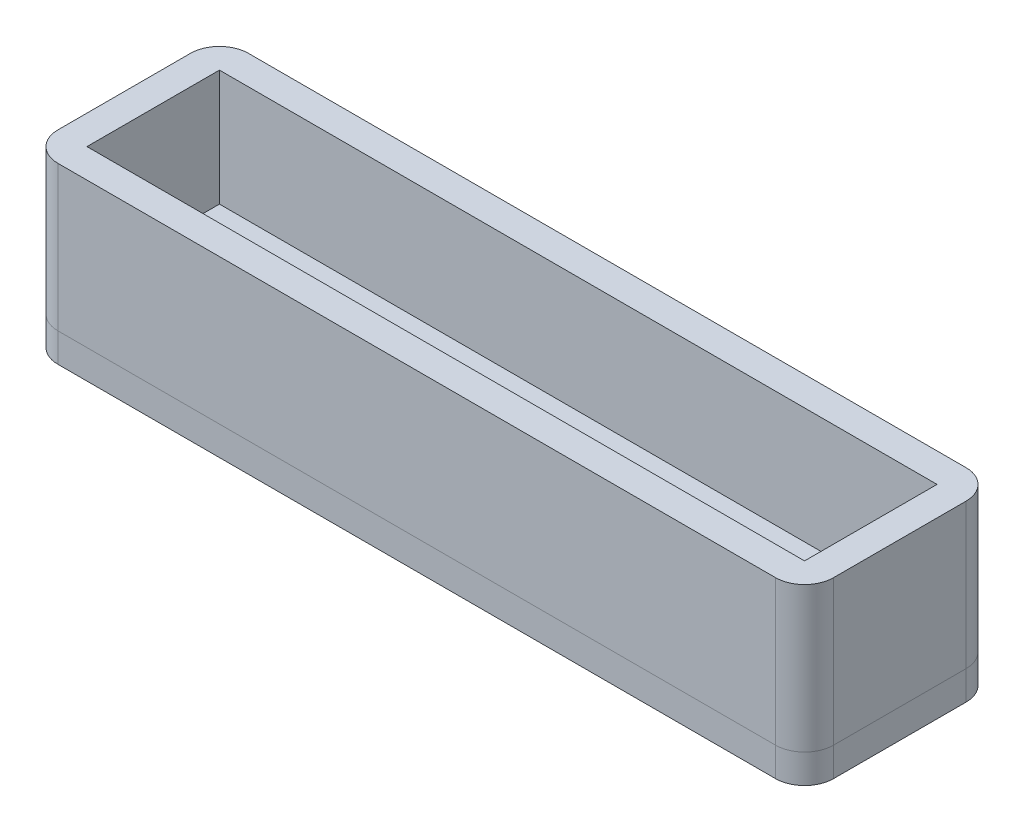
ISO-10303-21;
HEADER;
FILE_DESCRIPTION(('STEP AP214'),'2;1');
FILE_NAME('part.step','',(''),(''),'','','');
FILE_SCHEMA(('AUTOMOTIVE_DESIGN { 1 0 10303 214 1 1 1 1 }'));
ENDSEC;
DATA;
#1=APPLICATION_CONTEXT('core data for automotive mechanical design processes');
#2=APPLICATION_PROTOCOL_DEFINITION('international standard','automotive_design',2000,#1);
#3=PRODUCT_CONTEXT('',#1,'mechanical');
#4=PRODUCT('Part','Part','',(#3));
#5=PRODUCT_RELATED_PRODUCT_CATEGORY('part','',(#4));
#6=PRODUCT_DEFINITION_FORMATION('','',#4);
#7=PRODUCT_DEFINITION_CONTEXT('part definition',#1,'design');
#8=PRODUCT_DEFINITION('design','',#6,#7);
#9=PRODUCT_DEFINITION_SHAPE('','',#8);
#10=(LENGTH_UNIT() NAMED_UNIT(*) SI_UNIT(.MILLI.,.METRE.));
#11=(NAMED_UNIT(*) PLANE_ANGLE_UNIT() SI_UNIT($,.RADIAN.));
#12=(NAMED_UNIT(*) SI_UNIT($,.STERADIAN.) SOLID_ANGLE_UNIT());
#13=UNCERTAINTY_MEASURE_WITH_UNIT(LENGTH_MEASURE(1.E-05),#10,'distance_accuracy_value','');
#14=(GEOMETRIC_REPRESENTATION_CONTEXT(3) GLOBAL_UNCERTAINTY_ASSIGNED_CONTEXT((#13)) GLOBAL_UNIT_ASSIGNED_CONTEXT((#10,
#11,#12)) REPRESENTATION_CONTEXT('',''));
#15=CARTESIAN_POINT('',(0.,0.,0.));
#16=DIRECTION('',(0.,0.,1.));
#17=DIRECTION('',(1.,0.,0.));
#18=AXIS2_PLACEMENT_3D('',#15,#16,#17);
#19=CARTESIAN_POINT('',(74.2,-3.,-13.7));
#20=DIRECTION('',(0.,1.,0.));
#21=DIRECTION('',(0.,0.,1.));
#22=AXIS2_PLACEMENT_3D('',#19,#20,#21);
#23=CYLINDRICAL_SURFACE('',#22,3.);
#24=CARTESIAN_POINT('',(74.2,0.,-13.7));
#25=DIRECTION('',(0.,-1.,0.));
#26=DIRECTION('',(0.,0.,-1.));
#27=AXIS2_PLACEMENT_3D('',#24,#25,#26);
#28=CIRCLE('',#27,3.);
#29=CARTESIAN_POINT('',(74.2,0.,-16.7));
#30=VERTEX_POINT('',#29);
#31=CARTESIAN_POINT('',(77.2,0.,-13.7));
#32=VERTEX_POINT('',#31);
#33=EDGE_CURVE('E143',#30,#32,#28,.T.);
#34=ORIENTED_EDGE('',*,*,#33,.T.);
#35=DIRECTION('',(0.,1.,0.));
#36=VECTOR('',#35,1.);
#37=CARTESIAN_POINT('',(77.2,-3.,-13.7));
#38=LINE('',#37,#36);
#39=CARTESIAN_POINT('',(77.2,-3.,-13.7));
#40=VERTEX_POINT('',#39);
#41=EDGE_CURVE('E12',#40,#32,#38,.T.);
#42=ORIENTED_EDGE('',*,*,#41,.F.);
#43=CARTESIAN_POINT('',(74.2,-3.,-13.7));
#44=DIRECTION('',(0.,-1.,0.));
#45=DIRECTION('',(0.,0.,-1.));
#46=AXIS2_PLACEMENT_3D('',#43,#44,#45);
#47=CIRCLE('',#46,3.);
#48=CARTESIAN_POINT('',(74.2,-3.,-16.7));
#49=VERTEX_POINT('',#48);
#50=EDGE_CURVE('E157',#49,#40,#47,.T.);
#51=ORIENTED_EDGE('',*,*,#50,.F.);
#52=DIRECTION('',(0.,1.,0.));
#53=VECTOR('',#52,1.);
#54=CARTESIAN_POINT('',(74.2,-3.,-16.7));
#55=LINE('',#54,#53);
#56=EDGE_CURVE('E139',#49,#30,#55,.T.);
#57=ORIENTED_EDGE('',*,*,#56,.T.);
#58=EDGE_LOOP('',(#34,#42,#51,#57));
#59=FACE_BOUND('',#58,.T.);
#60=ADVANCED_FACE('F47',(#59),#23,.T.);
#61=CARTESIAN_POINT('',(77.2,-3.,-13.7));
#62=DIRECTION('',(-1.,0.,0.));
#63=DIRECTION('',(0.,0.,1.));
#64=AXIS2_PLACEMENT_3D('',#61,#62,#63);
#65=PLANE('',#64);
#66=DIRECTION('',(0.,0.,1.));
#67=VECTOR('',#66,1.);
#68=CARTESIAN_POINT('',(77.2,0.,-13.7));
#69=LINE('',#68,#67);
#70=CARTESIAN_POINT('',(77.2,0.,0.));
#71=VERTEX_POINT('',#70);
#72=EDGE_CURVE('E146',#32,#71,#69,.T.);
#73=ORIENTED_EDGE('',*,*,#72,.T.);
#74=DIRECTION('',(0.,1.,0.));
#75=VECTOR('',#74,1.);
#76=CARTESIAN_POINT('',(77.2,-3.,0.));
#77=LINE('',#76,#75);
#78=CARTESIAN_POINT('',(77.2,-3.,0.));
#79=VERTEX_POINT('',#78);
#80=EDGE_CURVE('E55',#79,#71,#77,.T.);
#81=ORIENTED_EDGE('',*,*,#80,.F.);
#82=DIRECTION('',(0.,0.,1.));
#83=VECTOR('',#82,1.);
#84=CARTESIAN_POINT('',(77.2,-3.,-13.7));
#85=LINE('',#84,#83);
#86=EDGE_CURVE('E106',#40,#79,#85,.T.);
#87=ORIENTED_EDGE('',*,*,#86,.F.);
#88=ORIENTED_EDGE('',*,*,#41,.T.);
#89=EDGE_LOOP('',(#73,#81,#87,#88));
#90=FACE_BOUND('',#89,.T.);
#91=ADVANCED_FACE('F192',(#90),#65,.F.);
#92=CARTESIAN_POINT('',(74.2,-3.,0.));
#93=DIRECTION('',(0.,1.,0.));
#94=DIRECTION('',(0.,0.,1.));
#95=AXIS2_PLACEMENT_3D('',#92,#93,#94);
#96=CYLINDRICAL_SURFACE('',#95,3.);
#97=CARTESIAN_POINT('',(74.2,0.,0.));
#98=DIRECTION('',(0.,-1.,0.));
#99=DIRECTION('',(0.,0.,-1.));
#100=AXIS2_PLACEMENT_3D('',#97,#98,#99);
#101=CIRCLE('',#100,3.);
#102=CARTESIAN_POINT('',(74.2,0.,3.));
#103=VERTEX_POINT('',#102);
#104=EDGE_CURVE('E148',#71,#103,#101,.T.);
#105=ORIENTED_EDGE('',*,*,#104,.T.);
#106=DIRECTION('',(0.,1.,0.));
#107=VECTOR('',#106,1.);
#108=CARTESIAN_POINT('',(74.2,-3.,3.));
#109=LINE('',#108,#107);
#110=CARTESIAN_POINT('',(74.2,-3.,3.));
#111=VERTEX_POINT('',#110);
#112=EDGE_CURVE('E164',#111,#103,#109,.T.);
#113=ORIENTED_EDGE('',*,*,#112,.F.);
#114=CARTESIAN_POINT('',(74.2,-3.,0.));
#115=DIRECTION('',(0.,-1.,0.));
#116=DIRECTION('',(0.,0.,-1.));
#117=AXIS2_PLACEMENT_3D('',#114,#115,#116);
#118=CIRCLE('',#117,3.);
#119=EDGE_CURVE('E172',#79,#111,#118,.T.);
#120=ORIENTED_EDGE('',*,*,#119,.F.);
#121=ORIENTED_EDGE('',*,*,#80,.T.);
#122=EDGE_LOOP('',(#105,#113,#120,#121));
#123=FACE_BOUND('',#122,.T.);
#124=ADVANCED_FACE('F170',(#123),#96,.T.);
#125=CARTESIAN_POINT('',(74.2,-3.,3.));
#126=DIRECTION('',(0.,0.,-1.));
#127=DIRECTION('',(-1.,0.,0.));
#128=AXIS2_PLACEMENT_3D('',#125,#126,#127);
#129=PLANE('',#128);
#130=DIRECTION('',(-1.,0.,0.));
#131=VECTOR('',#130,1.);
#132=CARTESIAN_POINT('',(74.2,0.,3.));
#133=LINE('',#132,#131);
#134=CARTESIAN_POINT('',(0.,0.,3.));
#135=VERTEX_POINT('',#134);
#136=EDGE_CURVE('E150',#103,#135,#133,.T.);
#137=ORIENTED_EDGE('',*,*,#136,.T.);
#138=DIRECTION('',(0.,1.,0.));
#139=VECTOR('',#138,1.);
#140=CARTESIAN_POINT('',(0.,-3.,3.));
#141=LINE('',#140,#139);
#142=CARTESIAN_POINT('',(0.,-3.,3.));
#143=VERTEX_POINT('',#142);
#144=EDGE_CURVE('E161',#143,#135,#141,.T.);
#145=ORIENTED_EDGE('',*,*,#144,.F.);
#146=DIRECTION('',(-1.,0.,0.));
#147=VECTOR('',#146,1.);
#148=CARTESIAN_POINT('',(74.2,-3.,3.));
#149=LINE('',#148,#147);
#150=EDGE_CURVE('E184',#111,#143,#149,.T.);
#151=ORIENTED_EDGE('',*,*,#150,.F.);
#152=ORIENTED_EDGE('',*,*,#112,.T.);
#153=EDGE_LOOP('',(#137,#145,#151,#152));
#154=FACE_BOUND('',#153,.T.);
#155=ADVANCED_FACE('F180',(#154),#129,.F.);
#156=CARTESIAN_POINT('',(0.,-3.,0.));
#157=DIRECTION('',(0.,1.,0.));
#158=DIRECTION('',(0.,0.,1.));
#159=AXIS2_PLACEMENT_3D('',#156,#157,#158);
#160=CYLINDRICAL_SURFACE('',#159,3.);
#161=CARTESIAN_POINT('',(0.,0.,0.));
#162=DIRECTION('',(0.,-1.,0.));
#163=DIRECTION('',(0.,0.,-1.));
#164=AXIS2_PLACEMENT_3D('',#161,#162,#163);
#165=CIRCLE('',#164,3.);
#166=CARTESIAN_POINT('',(-3.,0.,0.));
#167=VERTEX_POINT('',#166);
#168=EDGE_CURVE('E152',#135,#167,#165,.T.);
#169=ORIENTED_EDGE('',*,*,#168,.T.);
#170=DIRECTION('',(0.,1.,0.));
#171=VECTOR('',#170,1.);
#172=CARTESIAN_POINT('',(-3.,-3.,0.));
#173=LINE('',#172,#171);
#174=CARTESIAN_POINT('',(-3.,-3.,0.));
#175=VERTEX_POINT('',#174);
#176=EDGE_CURVE('E134',#175,#167,#173,.T.);
#177=ORIENTED_EDGE('',*,*,#176,.F.);
#178=CARTESIAN_POINT('',(0.,-3.,0.));
#179=DIRECTION('',(0.,-1.,0.));
#180=DIRECTION('',(0.,0.,-1.));
#181=AXIS2_PLACEMENT_3D('',#178,#179,#180);
#182=CIRCLE('',#181,3.);
#183=EDGE_CURVE('E125',#143,#175,#182,.T.);
#184=ORIENTED_EDGE('',*,*,#183,.F.);
#185=ORIENTED_EDGE('',*,*,#144,.T.);
#186=EDGE_LOOP('',(#169,#177,#184,#185));
#187=FACE_BOUND('',#186,.T.);
#188=ADVANCED_FACE('F183',(#187),#160,.T.);
#189=CARTESIAN_POINT('',(-3.,-3.,0.));
#190=DIRECTION('',(1.,0.,0.));
#191=DIRECTION('',(0.,0.,-1.));
#192=AXIS2_PLACEMENT_3D('',#189,#190,#191);
#193=PLANE('',#192);
#194=DIRECTION('',(0.,0.,-1.));
#195=VECTOR('',#194,1.);
#196=CARTESIAN_POINT('',(-3.,0.,0.));
#197=LINE('',#196,#195);
#198=CARTESIAN_POINT('',(-3.,0.,-13.7));
#199=VERTEX_POINT('',#198);
#200=EDGE_CURVE('E133',#167,#199,#197,.T.);
#201=ORIENTED_EDGE('',*,*,#200,.T.);
#202=DIRECTION('',(0.,1.,0.));
#203=VECTOR('',#202,1.);
#204=CARTESIAN_POINT('',(-3.,-3.,-13.7));
#205=LINE('',#204,#203);
#206=CARTESIAN_POINT('',(-3.,-3.,-13.7));
#207=VERTEX_POINT('',#206);
#208=EDGE_CURVE('E130',#207,#199,#205,.T.);
#209=ORIENTED_EDGE('',*,*,#208,.F.);
#210=DIRECTION('',(0.,0.,-1.));
#211=VECTOR('',#210,1.);
#212=CARTESIAN_POINT('',(-3.,-3.,0.));
#213=LINE('',#212,#211);
#214=EDGE_CURVE('E119',#175,#207,#213,.T.);
#215=ORIENTED_EDGE('',*,*,#214,.F.);
#216=ORIENTED_EDGE('',*,*,#176,.T.);
#217=EDGE_LOOP('',(#201,#209,#215,#216));
#218=FACE_BOUND('',#217,.T.);
#219=ADVANCED_FACE('F131',(#218),#193,.F.);
#220=CARTESIAN_POINT('',(0.,-3.,-13.7));
#221=DIRECTION('',(0.,1.,0.));
#222=DIRECTION('',(0.,0.,1.));
#223=AXIS2_PLACEMENT_3D('',#220,#221,#222);
#224=CYLINDRICAL_SURFACE('',#223,3.);
#225=CARTESIAN_POINT('',(0.,0.,-13.7));
#226=DIRECTION('',(0.,-1.,0.));
#227=DIRECTION('',(0.,0.,-1.));
#228=AXIS2_PLACEMENT_3D('',#225,#226,#227);
#229=CIRCLE('',#228,3.);
#230=CARTESIAN_POINT('',(0.,0.,-16.7));
#231=VERTEX_POINT('',#230);
#232=EDGE_CURVE('E92',#199,#231,#229,.T.);
#233=ORIENTED_EDGE('',*,*,#232,.T.);
#234=DIRECTION('',(0.,1.,0.));
#235=VECTOR('',#234,1.);
#236=CARTESIAN_POINT('',(0.,-3.,-16.7));
#237=LINE('',#236,#235);
#238=CARTESIAN_POINT('',(0.,-3.,-16.7));
#239=VERTEX_POINT('',#238);
#240=EDGE_CURVE('E135',#239,#231,#237,.T.);
#241=ORIENTED_EDGE('',*,*,#240,.F.);
#242=CARTESIAN_POINT('',(0.,-3.,-13.7));
#243=DIRECTION('',(0.,-1.,0.));
#244=DIRECTION('',(0.,0.,-1.));
#245=AXIS2_PLACEMENT_3D('',#242,#243,#244);
#246=CIRCLE('',#245,3.);
#247=EDGE_CURVE('E123',#207,#239,#246,.T.);
#248=ORIENTED_EDGE('',*,*,#247,.F.);
#249=ORIENTED_EDGE('',*,*,#208,.T.);
#250=EDGE_LOOP('',(#233,#241,#248,#249));
#251=FACE_BOUND('',#250,.T.);
#252=ADVANCED_FACE('F137',(#251),#224,.T.);
#253=CARTESIAN_POINT('',(0.,-3.,-16.7));
#254=DIRECTION('',(0.,0.,1.));
#255=DIRECTION('',(1.,0.,0.));
#256=AXIS2_PLACEMENT_3D('',#253,#254,#255);
#257=PLANE('',#256);
#258=DIRECTION('',(1.,0.,0.));
#259=VECTOR('',#258,1.);
#260=CARTESIAN_POINT('',(0.,0.,-16.7));
#261=LINE('',#260,#259);
#262=EDGE_CURVE('E98',#231,#30,#261,.T.);
#263=ORIENTED_EDGE('',*,*,#262,.T.);
#264=ORIENTED_EDGE('',*,*,#56,.F.);
#265=DIRECTION('',(1.,0.,0.));
#266=VECTOR('',#265,1.);
#267=CARTESIAN_POINT('',(0.,-3.,-16.7));
#268=LINE('',#267,#266);
#269=EDGE_CURVE('E63',#239,#49,#268,.T.);
#270=ORIENTED_EDGE('',*,*,#269,.F.);
#271=ORIENTED_EDGE('',*,*,#240,.T.);
#272=EDGE_LOOP('',(#263,#264,#270,#271));
#273=FACE_BOUND('',#272,.T.);
#274=ADVANCED_FACE('F208',(#273),#257,.F.);
#275=CARTESIAN_POINT('',(74.2,-3.,-13.7));
#276=DIRECTION('',(0.,-1.,0.));
#277=DIRECTION('',(0.,0.,-1.));
#278=AXIS2_PLACEMENT_3D('',#275,#276,#277);
#279=PLANE('',#278);
#280=ORIENTED_EDGE('',*,*,#50,.T.);
#281=ORIENTED_EDGE('',*,*,#86,.T.);
#282=ORIENTED_EDGE('',*,*,#119,.T.);
#283=ORIENTED_EDGE('',*,*,#150,.T.);
#284=ORIENTED_EDGE('',*,*,#183,.T.);
#285=ORIENTED_EDGE('',*,*,#214,.T.);
#286=ORIENTED_EDGE('',*,*,#247,.T.);
#287=ORIENTED_EDGE('',*,*,#269,.T.);
#288=EDGE_LOOP('',(#280,#281,#282,#283,#284,#285,#286,#287));
#289=FACE_BOUND('',#288,.T.);
#290=ADVANCED_FACE('F121',(#289),#279,.T.);
#291=CARTESIAN_POINT('',(74.2,0.,-13.7));
#292=DIRECTION('',(0.,-1.,0.));
#293=DIRECTION('',(0.,0.,-1.));
#294=AXIS2_PLACEMENT_3D('',#291,#292,#293);
#295=PLANE('',#294);
#296=ORIENTED_EDGE('',*,*,#33,.F.);
#297=ORIENTED_EDGE('',*,*,#262,.F.);
#298=ORIENTED_EDGE('',*,*,#232,.F.);
#299=ORIENTED_EDGE('',*,*,#200,.F.);
#300=ORIENTED_EDGE('',*,*,#168,.F.);
#301=ORIENTED_EDGE('',*,*,#136,.F.);
#302=ORIENTED_EDGE('',*,*,#104,.F.);
#303=ORIENTED_EDGE('',*,*,#72,.F.);
#304=EDGE_LOOP('',(#296,#297,#298,#299,#300,#301,#302,#303));
#305=FACE_BOUND('',#304,.T.);
#306=ADVANCED_FACE('F176',(#305),#295,.F.);
#307=CLOSED_SHELL('',(#60,#91,#124,#155,#188,#219,#252,#274,#290,#306));
#308=MANIFOLD_SOLID_BREP('B2',#307);
#309=CARTESIAN_POINT('',(0.,3.,0.));
#310=DIRECTION('',(0.,-1.,0.));
#311=DIRECTION('',(0.,0.,-1.));
#312=AXIS2_PLACEMENT_3D('',#309,#310,#311);
#313=PLANE('',#312);
#314=DIRECTION('',(0.,0.,1.));
#315=VECTOR('',#314,1.);
#316=CARTESIAN_POINT('',(0.,3.,0.));
#317=LINE('',#316,#315);
#318=CARTESIAN_POINT('',(0.,3.,-13.7));
#319=VERTEX_POINT('',#318);
#320=CARTESIAN_POINT('',(0.,3.,0.));
#321=VERTEX_POINT('',#320);
#322=EDGE_CURVE('E412',#319,#321,#317,.T.);
#323=ORIENTED_EDGE('',*,*,#322,.T.);
#324=DIRECTION('',(1.,0.,0.));
#325=VECTOR('',#324,1.);
#326=CARTESIAN_POINT('',(0.,3.,0.));
#327=LINE('',#326,#325);
#328=CARTESIAN_POINT('',(74.2,3.,0.));
#329=VERTEX_POINT('',#328);
#330=EDGE_CURVE('E372',#321,#329,#327,.T.);
#331=ORIENTED_EDGE('',*,*,#330,.T.);
#332=DIRECTION('',(0.,0.,-1.));
#333=VECTOR('',#332,1.);
#334=CARTESIAN_POINT('',(74.2,3.,0.));
#335=LINE('',#334,#333);
#336=CARTESIAN_POINT('',(74.2,3.,-13.7));
#337=VERTEX_POINT('',#336);
#338=EDGE_CURVE('E425',#329,#337,#335,.T.);
#339=ORIENTED_EDGE('',*,*,#338,.T.);
#340=DIRECTION('',(-1.,0.,0.));
#341=VECTOR('',#340,1.);
#342=CARTESIAN_POINT('',(0.,3.,-13.7));
#343=LINE('',#342,#341);
#344=EDGE_CURVE('E428',#337,#319,#343,.T.);
#345=ORIENTED_EDGE('',*,*,#344,.T.);
#346=EDGE_LOOP('',(#323,#331,#339,#345));
#347=FACE_BOUND('',#346,.T.);
#348=ADVANCED_FACE('F274',(#347),#313,.F.);
#349=CARTESIAN_POINT('',(74.2,15.,0.));
#350=DIRECTION('',(0.,0.,1.));
#351=DIRECTION('',(1.,0.,0.));
#352=AXIS2_PLACEMENT_3D('',#349,#350,#351);
#353=PLANE('',#352);
#354=DIRECTION('',(0.,-1.,0.));
#355=VECTOR('',#354,1.);
#356=CARTESIAN_POINT('',(74.2,15.,0.));
#357=LINE('',#356,#355);
#358=CARTESIAN_POINT('',(74.2,15.,0.));
#359=VERTEX_POINT('',#358);
#360=EDGE_CURVE('E393',#359,#329,#357,.T.);
#361=ORIENTED_EDGE('',*,*,#360,.T.);
#362=ORIENTED_EDGE('',*,*,#330,.F.);
#363=DIRECTION('',(0.,-1.,0.));
#364=VECTOR('',#363,1.);
#365=CARTESIAN_POINT('',(0.,15.,0.));
#366=LINE('',#365,#364);
#367=CARTESIAN_POINT('',(0.,15.,0.));
#368=VERTEX_POINT('',#367);
#369=EDGE_CURVE('E364',#368,#321,#366,.T.);
#370=ORIENTED_EDGE('',*,*,#369,.F.);
#371=DIRECTION('',(-1.,0.,0.));
#372=VECTOR('',#371,1.);
#373=CARTESIAN_POINT('',(74.2,15.,0.));
#374=LINE('',#373,#372);
#375=EDGE_CURVE('E369',#359,#368,#374,.T.);
#376=ORIENTED_EDGE('',*,*,#375,.F.);
#377=EDGE_LOOP('',(#361,#362,#370,#376));
#378=FACE_BOUND('',#377,.T.);
#379=ADVANCED_FACE('F367',(#378),#353,.F.);
#380=CARTESIAN_POINT('',(74.2,15.,-13.7));
#381=DIRECTION('',(1.,0.,0.));
#382=DIRECTION('',(0.,0.,-1.));
#383=AXIS2_PLACEMENT_3D('',#380,#381,#382);
#384=PLANE('',#383);
#385=DIRECTION('',(0.,-1.,0.));
#386=VECTOR('',#385,1.);
#387=CARTESIAN_POINT('',(74.2,15.,-13.7));
#388=LINE('',#387,#386);
#389=CARTESIAN_POINT('',(74.2,15.,-13.7));
#390=VERTEX_POINT('',#389);
#391=EDGE_CURVE('E396',#390,#337,#388,.T.);
#392=ORIENTED_EDGE('',*,*,#391,.T.);
#393=ORIENTED_EDGE('',*,*,#338,.F.);
#394=ORIENTED_EDGE('',*,*,#360,.F.);
#395=DIRECTION('',(0.,0.,1.));
#396=VECTOR('',#395,1.);
#397=CARTESIAN_POINT('',(74.2,15.,-13.7));
#398=LINE('',#397,#396);
#399=EDGE_CURVE('E376',#390,#359,#398,.T.);
#400=ORIENTED_EDGE('',*,*,#399,.F.);
#401=EDGE_LOOP('',(#392,#393,#394,#400));
#402=FACE_BOUND('',#401,.T.);
#403=ADVANCED_FACE('F504',(#402),#384,.F.);
#404=CARTESIAN_POINT('',(0.,15.,-13.7));
#405=DIRECTION('',(0.,0.,-1.));
#406=DIRECTION('',(-1.,0.,0.));
#407=AXIS2_PLACEMENT_3D('',#404,#405,#406);
#408=PLANE('',#407);
#409=DIRECTION('',(0.,-1.,0.));
#410=VECTOR('',#409,1.);
#411=CARTESIAN_POINT('',(0.,15.,-13.7));
#412=LINE('',#411,#410);
#413=CARTESIAN_POINT('',(0.,15.,-13.7));
#414=VERTEX_POINT('',#413);
#415=EDGE_CURVE('E375',#414,#319,#412,.T.);
#416=ORIENTED_EDGE('',*,*,#415,.T.);
#417=ORIENTED_EDGE('',*,*,#344,.F.);
#418=ORIENTED_EDGE('',*,*,#391,.F.);
#419=DIRECTION('',(1.,0.,0.));
#420=VECTOR('',#419,1.);
#421=CARTESIAN_POINT('',(0.,15.,-13.7));
#422=LINE('',#421,#420);
#423=EDGE_CURVE('E385',#414,#390,#422,.T.);
#424=ORIENTED_EDGE('',*,*,#423,.F.);
#425=EDGE_LOOP('',(#416,#417,#418,#424));
#426=FACE_BOUND('',#425,.T.);
#427=ADVANCED_FACE('F583',(#426),#408,.F.);
#428=CARTESIAN_POINT('',(0.,15.,0.));
#429=DIRECTION('',(-1.,0.,0.));
#430=DIRECTION('',(0.,0.,1.));
#431=AXIS2_PLACEMENT_3D('',#428,#429,#430);
#432=PLANE('',#431);
#433=ORIENTED_EDGE('',*,*,#369,.T.);
#434=ORIENTED_EDGE('',*,*,#322,.F.);
#435=ORIENTED_EDGE('',*,*,#415,.F.);
#436=DIRECTION('',(0.,0.,-1.));
#437=VECTOR('',#436,1.);
#438=CARTESIAN_POINT('',(0.,15.,0.));
#439=LINE('',#438,#437);
#440=EDGE_CURVE('E380',#368,#414,#439,.T.);
#441=ORIENTED_EDGE('',*,*,#440,.F.);
#442=EDGE_LOOP('',(#433,#434,#435,#441));
#443=FACE_BOUND('',#442,.T.);
#444=ADVANCED_FACE('F381',(#443),#432,.F.);
#445=CARTESIAN_POINT('',(77.2,15.,-16.7));
#446=DIRECTION('',(1.,0.,0.));
#447=DIRECTION('',(0.,0.,-1.));
#448=AXIS2_PLACEMENT_3D('',#445,#446,#447);
#449=PLANE('',#448);
#450=DIRECTION('',(0.,0.,1.));
#451=VECTOR('',#450,1.);
#452=CARTESIAN_POINT('',(77.2,15.,-16.7));
#453=LINE('',#452,#451);
#454=CARTESIAN_POINT('',(77.2,15.,-13.7));
#455=VERTEX_POINT('',#454);
#456=CARTESIAN_POINT('',(77.2,15.,0.));
#457=VERTEX_POINT('',#456);
#458=EDGE_CURVE('E400',#455,#457,#453,.T.);
#459=ORIENTED_EDGE('',*,*,#458,.T.);
#460=DIRECTION('',(0.,-1.,0.));
#461=VECTOR('',#460,1.);
#462=CARTESIAN_POINT('',(77.2,15.,0.));
#463=LINE('',#462,#461);
#464=CARTESIAN_POINT('',(77.2,0.,0.));
#465=VERTEX_POINT('',#464);
#466=EDGE_CURVE('E433',#457,#465,#463,.T.);
#467=ORIENTED_EDGE('',*,*,#466,.T.);
#468=DIRECTION('',(0.,0.,1.));
#469=VECTOR('',#468,1.);
#470=CARTESIAN_POINT('',(77.2,0.,-16.7));
#471=LINE('',#470,#469);
#472=CARTESIAN_POINT('',(77.2,0.,-13.7));
#473=VERTEX_POINT('',#472);
#474=EDGE_CURVE('E395',#473,#465,#471,.T.);
#475=ORIENTED_EDGE('',*,*,#474,.F.);
#476=DIRECTION('',(0.,-1.,0.));
#477=VECTOR('',#476,1.);
#478=CARTESIAN_POINT('',(77.2,15.,-13.7));
#479=LINE('',#478,#477);
#480=EDGE_CURVE('E431',#473,#455,#479,.F.);
#481=ORIENTED_EDGE('',*,*,#480,.T.);
#482=EDGE_LOOP('',(#459,#467,#475,#481));
#483=FACE_BOUND('',#482,.T.);
#484=ADVANCED_FACE('F487',(#483),#449,.T.);
#485=CARTESIAN_POINT('',(-3.,15.,-16.7));
#486=DIRECTION('',(0.,0.,-1.));
#487=DIRECTION('',(-1.,0.,0.));
#488=AXIS2_PLACEMENT_3D('',#485,#486,#487);
#489=PLANE('',#488);
#490=DIRECTION('',(1.,0.,0.));
#491=VECTOR('',#490,1.);
#492=CARTESIAN_POINT('',(-3.,15.,-16.7));
#493=LINE('',#492,#491);
#494=CARTESIAN_POINT('',(0.,15.,-16.7));
#495=VERTEX_POINT('',#494);
#496=CARTESIAN_POINT('',(74.2,15.,-16.7));
#497=VERTEX_POINT('',#496);
#498=EDGE_CURVE('E409',#495,#497,#493,.T.);
#499=ORIENTED_EDGE('',*,*,#498,.T.);
#500=DIRECTION('',(0.,-1.,0.));
#501=VECTOR('',#500,1.);
#502=CARTESIAN_POINT('',(74.2,15.,-16.7));
#503=LINE('',#502,#501);
#504=CARTESIAN_POINT('',(74.2,0.,-16.7));
#505=VERTEX_POINT('',#504);
#506=EDGE_CURVE('E458',#497,#505,#503,.T.);
#507=ORIENTED_EDGE('',*,*,#506,.T.);
#508=DIRECTION('',(1.,0.,0.));
#509=VECTOR('',#508,1.);
#510=CARTESIAN_POINT('',(-3.,0.,-16.7));
#511=LINE('',#510,#509);
#512=CARTESIAN_POINT('',(0.,0.,-16.7));
#513=VERTEX_POINT('',#512);
#514=EDGE_CURVE('E404',#513,#505,#511,.T.);
#515=ORIENTED_EDGE('',*,*,#514,.F.);
#516=DIRECTION('',(0.,-1.,0.));
#517=VECTOR('',#516,1.);
#518=CARTESIAN_POINT('',(0.,15.,-16.7));
#519=LINE('',#518,#517);
#520=EDGE_CURVE('E456',#513,#495,#519,.F.);
#521=ORIENTED_EDGE('',*,*,#520,.T.);
#522=EDGE_LOOP('',(#499,#507,#515,#521));
#523=FACE_BOUND('',#522,.T.);
#524=ADVANCED_FACE('F463',(#523),#489,.T.);
#525=CARTESIAN_POINT('',(-3.,15.,3.));
#526=DIRECTION('',(-1.,0.,0.));
#527=DIRECTION('',(0.,0.,1.));
#528=AXIS2_PLACEMENT_3D('',#525,#526,#527);
#529=PLANE('',#528);
#530=DIRECTION('',(0.,0.,-1.));
#531=VECTOR('',#530,1.);
#532=CARTESIAN_POINT('',(-3.,15.,3.));
#533=LINE('',#532,#531);
#534=CARTESIAN_POINT('',(-3.,15.,0.));
#535=VERTEX_POINT('',#534);
#536=CARTESIAN_POINT('',(-3.,15.,-13.7));
#537=VERTEX_POINT('',#536);
#538=EDGE_CURVE('E407',#535,#537,#533,.T.);
#539=ORIENTED_EDGE('',*,*,#538,.T.);
#540=DIRECTION('',(0.,-1.,0.));
#541=VECTOR('',#540,1.);
#542=CARTESIAN_POINT('',(-3.,15.,-13.7));
#543=LINE('',#542,#541);
#544=CARTESIAN_POINT('',(-3.,0.,-13.7));
#545=VERTEX_POINT('',#544);
#546=EDGE_CURVE('E45',#537,#545,#543,.T.);
#547=ORIENTED_EDGE('',*,*,#546,.T.);
#548=DIRECTION('',(0.,0.,-1.));
#549=VECTOR('',#548,1.);
#550=CARTESIAN_POINT('',(-3.,0.,3.));
#551=LINE('',#550,#549);
#552=CARTESIAN_POINT('',(-3.,0.,0.));
#553=VERTEX_POINT('',#552);
#554=EDGE_CURVE('E418',#553,#545,#551,.T.);
#555=ORIENTED_EDGE('',*,*,#554,.F.);
#556=DIRECTION('',(0.,-1.,0.));
#557=VECTOR('',#556,1.);
#558=CARTESIAN_POINT('',(-3.,15.,0.));
#559=LINE('',#558,#557);
#560=EDGE_CURVE('E282',#553,#535,#559,.F.);
#561=ORIENTED_EDGE('',*,*,#560,.T.);
#562=EDGE_LOOP('',(#539,#547,#555,#561));
#563=FACE_BOUND('',#562,.T.);
#564=ADVANCED_FACE('F473',(#563),#529,.T.);
#565=CARTESIAN_POINT('',(77.2,15.,3.));
#566=DIRECTION('',(0.,0.,1.));
#567=DIRECTION('',(1.,0.,0.));
#568=AXIS2_PLACEMENT_3D('',#565,#566,#567);
#569=PLANE('',#568);
#570=DIRECTION('',(-1.,0.,0.));
#571=VECTOR('',#570,1.);
#572=CARTESIAN_POINT('',(77.2,0.,3.));
#573=LINE('',#572,#571);
#574=CARTESIAN_POINT('',(74.2,0.,3.));
#575=VERTEX_POINT('',#574);
#576=CARTESIAN_POINT('',(0.,0.,3.));
#577=VERTEX_POINT('',#576);
#578=EDGE_CURVE('E415',#575,#577,#573,.T.);
#579=ORIENTED_EDGE('',*,*,#578,.F.);
#580=DIRECTION('',(0.,-1.,0.));
#581=VECTOR('',#580,1.);
#582=CARTESIAN_POINT('',(74.2,15.,3.));
#583=LINE('',#582,#581);
#584=CARTESIAN_POINT('',(74.2,15.,3.));
#585=VERTEX_POINT('',#584);
#586=EDGE_CURVE('E447',#575,#585,#583,.F.);
#587=ORIENTED_EDGE('',*,*,#586,.T.);
#588=DIRECTION('',(-1.,0.,0.));
#589=VECTOR('',#588,1.);
#590=CARTESIAN_POINT('',(77.2,15.,3.));
#591=LINE('',#590,#589);
#592=CARTESIAN_POINT('',(0.,15.,3.));
#593=VERTEX_POINT('',#592);
#594=EDGE_CURVE('E403',#585,#593,#591,.T.);
#595=ORIENTED_EDGE('',*,*,#594,.T.);
#596=DIRECTION('',(0.,-1.,0.));
#597=VECTOR('',#596,1.);
#598=CARTESIAN_POINT('',(0.,15.,3.));
#599=LINE('',#598,#597);
#600=EDGE_CURVE('E444',#593,#577,#599,.T.);
#601=ORIENTED_EDGE('',*,*,#600,.T.);
#602=EDGE_LOOP('',(#579,#587,#595,#601));
#603=FACE_BOUND('',#602,.T.);
#604=ADVANCED_FACE('F480',(#603),#569,.T.);
#605=CARTESIAN_POINT('',(0.,15.,0.));
#606=DIRECTION('',(0.,-1.,0.));
#607=DIRECTION('',(0.,0.,-1.));
#608=AXIS2_PLACEMENT_3D('',#605,#606,#607);
#609=PLANE('',#608);
#610=ORIENTED_EDGE('',*,*,#399,.T.);
#611=ORIENTED_EDGE('',*,*,#375,.T.);
#612=ORIENTED_EDGE('',*,*,#440,.T.);
#613=ORIENTED_EDGE('',*,*,#423,.T.);
#614=EDGE_LOOP('',(#610,#611,#612,#613));
#615=FACE_BOUND('',#614,.T.);
#616=ORIENTED_EDGE('',*,*,#594,.F.);
#617=CARTESIAN_POINT('',(74.2,15.,0.));
#618=DIRECTION('',(0.,-1.,0.));
#619=DIRECTION('',(0.,0.,-1.));
#620=AXIS2_PLACEMENT_3D('',#617,#618,#619);
#621=CIRCLE('',#620,3.);
#622=EDGE_CURVE('E454',#585,#457,#621,.F.);
#623=ORIENTED_EDGE('',*,*,#622,.T.);
#624=ORIENTED_EDGE('',*,*,#458,.F.);
#625=CARTESIAN_POINT('',(74.2,15.,-13.7));
#626=DIRECTION('',(0.,-1.,0.));
#627=DIRECTION('',(0.,0.,-1.));
#628=AXIS2_PLACEMENT_3D('',#625,#626,#627);
#629=CIRCLE('',#628,3.);
#630=EDGE_CURVE('E452',#455,#497,#629,.F.);
#631=ORIENTED_EDGE('',*,*,#630,.T.);
#632=ORIENTED_EDGE('',*,*,#498,.F.);
#633=CARTESIAN_POINT('',(0.,15.,-13.7));
#634=DIRECTION('',(0.,-1.,0.));
#635=DIRECTION('',(0.,0.,-1.));
#636=AXIS2_PLACEMENT_3D('',#633,#634,#635);
#637=CIRCLE('',#636,3.);
#638=EDGE_CURVE('E289',#495,#537,#637,.F.);
#639=ORIENTED_EDGE('',*,*,#638,.T.);
#640=ORIENTED_EDGE('',*,*,#538,.F.);
#641=CARTESIAN_POINT('',(0.,15.,0.));
#642=DIRECTION('',(0.,-1.,0.));
#643=DIRECTION('',(0.,0.,-1.));
#644=AXIS2_PLACEMENT_3D('',#641,#642,#643);
#645=CIRCLE('',#644,3.);
#646=EDGE_CURVE('E449',#535,#593,#645,.F.);
#647=ORIENTED_EDGE('',*,*,#646,.T.);
#648=EDGE_LOOP('',(#616,#623,#624,#631,#632,#639,#640,#647));
#649=FACE_BOUND('',#648,.T.);
#650=ADVANCED_FACE('F387',(#615,#649),#609,.F.);
#651=CARTESIAN_POINT('',(0.,0.,0.));
#652=DIRECTION('',(0.,-1.,0.));
#653=DIRECTION('',(0.,0.,-1.));
#654=AXIS2_PLACEMENT_3D('',#651,#652,#653);
#655=PLANE('',#654);
#656=ORIENTED_EDGE('',*,*,#474,.T.);
#657=CARTESIAN_POINT('',(74.2,0.,0.));
#658=DIRECTION('',(0.,-1.,0.));
#659=DIRECTION('',(0.,0.,-1.));
#660=AXIS2_PLACEMENT_3D('',#657,#658,#659);
#661=CIRCLE('',#660,3.);
#662=EDGE_CURVE('E442',#465,#575,#661,.T.);
#663=ORIENTED_EDGE('',*,*,#662,.T.);
#664=ORIENTED_EDGE('',*,*,#578,.T.);
#665=CARTESIAN_POINT('',(0.,0.,0.));
#666=DIRECTION('',(0.,-1.,0.));
#667=DIRECTION('',(0.,0.,-1.));
#668=AXIS2_PLACEMENT_3D('',#665,#666,#667);
#669=CIRCLE('',#668,3.);
#670=EDGE_CURVE('E436',#577,#553,#669,.T.);
#671=ORIENTED_EDGE('',*,*,#670,.T.);
#672=ORIENTED_EDGE('',*,*,#554,.T.);
#673=CARTESIAN_POINT('',(0.,0.,-13.7));
#674=DIRECTION('',(0.,-1.,0.));
#675=DIRECTION('',(0.,0.,-1.));
#676=AXIS2_PLACEMENT_3D('',#673,#674,#675);
#677=CIRCLE('',#676,3.);
#678=EDGE_CURVE('E438',#545,#513,#677,.T.);
#679=ORIENTED_EDGE('',*,*,#678,.T.);
#680=ORIENTED_EDGE('',*,*,#514,.T.);
#681=CARTESIAN_POINT('',(74.2,0.,-13.7));
#682=DIRECTION('',(0.,-1.,0.));
#683=DIRECTION('',(0.,0.,-1.));
#684=AXIS2_PLACEMENT_3D('',#681,#682,#683);
#685=CIRCLE('',#684,3.);
#686=EDGE_CURVE('E440',#505,#473,#685,.T.);
#687=ORIENTED_EDGE('',*,*,#686,.T.);
#688=EDGE_LOOP('',(#656,#663,#664,#671,#672,#679,#680,#687));
#689=FACE_BOUND('',#688,.T.);
#690=ADVANCED_FACE('F468',(#689),#655,.T.);
#691=CARTESIAN_POINT('',(74.2,15.,0.));
#692=DIRECTION('',(0.,-1.,0.));
#693=DIRECTION('',(0.,0.,-1.));
#694=AXIS2_PLACEMENT_3D('',#691,#692,#693);
#695=CYLINDRICAL_SURFACE('',#694,3.);
#696=ORIENTED_EDGE('',*,*,#622,.F.);
#697=ORIENTED_EDGE('',*,*,#586,.F.);
#698=ORIENTED_EDGE('',*,*,#662,.F.);
#699=ORIENTED_EDGE('',*,*,#466,.F.);
#700=EDGE_LOOP('',(#696,#697,#698,#699));
#701=FACE_BOUND('',#700,.T.);
#702=ADVANCED_FACE('F485',(#701),#695,.T.);
#703=CARTESIAN_POINT('',(74.2,15.,-13.7));
#704=DIRECTION('',(0.,-1.,0.));
#705=DIRECTION('',(0.,0.,-1.));
#706=AXIS2_PLACEMENT_3D('',#703,#704,#705);
#707=CYLINDRICAL_SURFACE('',#706,3.);
#708=ORIENTED_EDGE('',*,*,#630,.F.);
#709=ORIENTED_EDGE('',*,*,#480,.F.);
#710=ORIENTED_EDGE('',*,*,#686,.F.);
#711=ORIENTED_EDGE('',*,*,#506,.F.);
#712=EDGE_LOOP('',(#708,#709,#710,#711));
#713=FACE_BOUND('',#712,.T.);
#714=ADVANCED_FACE('F490',(#713),#707,.T.);
#715=CARTESIAN_POINT('',(0.,15.,-13.7));
#716=DIRECTION('',(0.,-1.,0.));
#717=DIRECTION('',(0.,0.,-1.));
#718=AXIS2_PLACEMENT_3D('',#715,#716,#717);
#719=CYLINDRICAL_SURFACE('',#718,3.);
#720=ORIENTED_EDGE('',*,*,#638,.F.);
#721=ORIENTED_EDGE('',*,*,#520,.F.);
#722=ORIENTED_EDGE('',*,*,#678,.F.);
#723=ORIENTED_EDGE('',*,*,#546,.F.);
#724=EDGE_LOOP('',(#720,#721,#722,#723));
#725=FACE_BOUND('',#724,.T.);
#726=ADVANCED_FACE('F472',(#725),#719,.T.);
#727=CARTESIAN_POINT('',(0.,15.,0.));
#728=DIRECTION('',(0.,-1.,0.));
#729=DIRECTION('',(0.,0.,-1.));
#730=AXIS2_PLACEMENT_3D('',#727,#728,#729);
#731=CYLINDRICAL_SURFACE('',#730,3.);
#732=ORIENTED_EDGE('',*,*,#646,.F.);
#733=ORIENTED_EDGE('',*,*,#560,.F.);
#734=ORIENTED_EDGE('',*,*,#670,.F.);
#735=ORIENTED_EDGE('',*,*,#600,.F.);
#736=EDGE_LOOP('',(#732,#733,#734,#735));
#737=FACE_BOUND('',#736,.T.);
#738=ADVANCED_FACE('F276',(#737),#731,.T.);
#739=CLOSED_SHELL('',(#348,#379,#403,#427,#444,#484,#524,#564,#604,#650,#690,#702,#714,#726,#738));
#740=MANIFOLD_SOLID_BREP('B6',#739);
#741=ADVANCED_BREP_SHAPE_REPRESENTATION('',(#18,#308,#740),#14);
#742=SHAPE_DEFINITION_REPRESENTATION(#9,#741);
ENDSEC;
END-ISO-10303-21;
